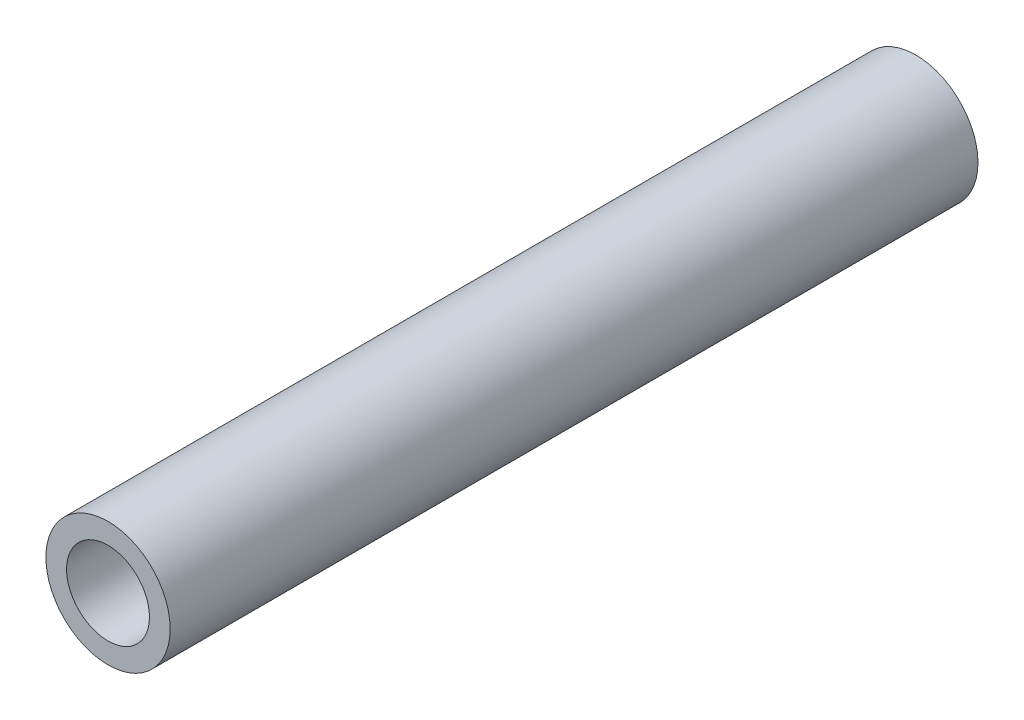
ISO-10303-21;
HEADER;
FILE_DESCRIPTION(('STEP AP214'),'2;1');
FILE_NAME('part.step','',(''),(''),'','','');
FILE_SCHEMA(('AUTOMOTIVE_DESIGN { 1 0 10303 214 1 1 1 1 }'));
ENDSEC;
DATA;
#1=APPLICATION_CONTEXT('core data for automotive mechanical design processes');
#2=APPLICATION_PROTOCOL_DEFINITION('international standard','automotive_design',2000,#1);
#3=PRODUCT_CONTEXT('',#1,'mechanical');
#4=PRODUCT('Part','Part','',(#3));
#5=PRODUCT_RELATED_PRODUCT_CATEGORY('part','',(#4));
#6=PRODUCT_DEFINITION_FORMATION('','',#4);
#7=PRODUCT_DEFINITION_CONTEXT('part definition',#1,'design');
#8=PRODUCT_DEFINITION('design','',#6,#7);
#9=PRODUCT_DEFINITION_SHAPE('','',#8);
#10=(LENGTH_UNIT() NAMED_UNIT(*) SI_UNIT(.MILLI.,.METRE.));
#11=(NAMED_UNIT(*) PLANE_ANGLE_UNIT() SI_UNIT($,.RADIAN.));
#12=(NAMED_UNIT(*) SI_UNIT($,.STERADIAN.) SOLID_ANGLE_UNIT());
#13=UNCERTAINTY_MEASURE_WITH_UNIT(LENGTH_MEASURE(1.E-05),#10,'distance_accuracy_value','');
#14=(GEOMETRIC_REPRESENTATION_CONTEXT(3) GLOBAL_UNCERTAINTY_ASSIGNED_CONTEXT((#13)) GLOBAL_UNIT_ASSIGNED_CONTEXT((#10,
#11,#12)) REPRESENTATION_CONTEXT('',''));
#15=CARTESIAN_POINT('',(0.,0.,0.));
#16=DIRECTION('',(0.,0.,1.));
#17=DIRECTION('',(1.,0.,0.));
#18=AXIS2_PLACEMENT_3D('',#15,#16,#17);
#19=CARTESIAN_POINT('',(0.,0.,19.5));
#20=DIRECTION('',(0.,0.,1.));
#21=DIRECTION('',(1.,0.,0.));
#22=AXIS2_PLACEMENT_3D('',#19,#20,#21);
#23=PLANE('',#22);
#24=CARTESIAN_POINT('',(0.,0.,19.5));
#25=DIRECTION('',(0.,0.,1.));
#26=DIRECTION('',(1.,0.,0.));
#27=AXIS2_PLACEMENT_3D('',#24,#25,#26);
#28=CIRCLE('',#27,3.);
#29=CARTESIAN_POINT('',(3.,0.,19.5));
#30=VERTEX_POINT('',#29);
#31=EDGE_CURVE('E11',#30,#30,#28,.T.);
#32=ORIENTED_EDGE('',*,*,#31,.T.);
#33=EDGE_LOOP('',(#32));
#34=FACE_BOUND('',#33,.T.);
#35=CARTESIAN_POINT('',(0.,0.,19.5));
#36=DIRECTION('',(0.,0.,1.));
#37=DIRECTION('',(1.,0.,0.));
#38=AXIS2_PLACEMENT_3D('',#35,#36,#37);
#39=CIRCLE('',#38,2.);
#40=CARTESIAN_POINT('',(2.,0.,19.5));
#41=VERTEX_POINT('',#40);
#42=EDGE_CURVE('E48',#41,#41,#39,.T.);
#43=ORIENTED_EDGE('',*,*,#42,.F.);
#44=EDGE_LOOP('',(#43));
#45=FACE_BOUND('',#44,.T.);
#46=ADVANCED_FACE('F37',(#34,#45),#23,.T.);
#47=CARTESIAN_POINT('',(0.,0.,-19.5));
#48=DIRECTION('',(0.,0.,1.));
#49=DIRECTION('',(1.,0.,0.));
#50=AXIS2_PLACEMENT_3D('',#47,#48,#49);
#51=PLANE('',#50);
#52=CARTESIAN_POINT('',(0.,0.,-19.5));
#53=DIRECTION('',(0.,0.,1.));
#54=DIRECTION('',(1.,0.,0.));
#55=AXIS2_PLACEMENT_3D('',#52,#53,#54);
#56=CIRCLE('',#55,3.);
#57=CARTESIAN_POINT('',(3.,0.,-19.5));
#58=VERTEX_POINT('',#57);
#59=EDGE_CURVE('E41',#58,#58,#56,.T.);
#60=ORIENTED_EDGE('',*,*,#59,.F.);
#61=EDGE_LOOP('',(#60));
#62=FACE_BOUND('',#61,.T.);
#63=CARTESIAN_POINT('',(0.,0.,-19.5));
#64=DIRECTION('',(0.,0.,1.));
#65=DIRECTION('',(1.,0.,0.));
#66=AXIS2_PLACEMENT_3D('',#63,#64,#65);
#67=CIRCLE('',#66,2.);
#68=CARTESIAN_POINT('',(2.,0.,-19.5));
#69=VERTEX_POINT('',#68);
#70=EDGE_CURVE('E50',#69,#69,#67,.T.);
#71=ORIENTED_EDGE('',*,*,#70,.T.);
#72=EDGE_LOOP('',(#71));
#73=FACE_BOUND('',#72,.T.);
#74=ADVANCED_FACE('F60',(#62,#73),#51,.F.);
#75=CARTESIAN_POINT('',(0.,0.,19.5));
#76=DIRECTION('',(0.,0.,-1.));
#77=DIRECTION('',(-1.,0.,0.));
#78=AXIS2_PLACEMENT_3D('',#75,#76,#77);
#79=CYLINDRICAL_SURFACE('',#78,3.);
#80=ORIENTED_EDGE('',*,*,#31,.F.);
#81=EDGE_LOOP('',(#80));
#82=FACE_BOUND('',#81,.T.);
#83=ORIENTED_EDGE('',*,*,#59,.T.);
#84=EDGE_LOOP('',(#83));
#85=FACE_BOUND('',#84,.T.);
#86=ADVANCED_FACE('F39',(#82,#85),#79,.T.);
#87=CARTESIAN_POINT('',(0.,0.,19.5));
#88=DIRECTION('',(0.,0.,-1.));
#89=DIRECTION('',(-1.,0.,0.));
#90=AXIS2_PLACEMENT_3D('',#87,#88,#89);
#91=CYLINDRICAL_SURFACE('',#90,2.);
#92=ORIENTED_EDGE('',*,*,#42,.T.);
#93=EDGE_LOOP('',(#92));
#94=FACE_BOUND('',#93,.T.);
#95=ORIENTED_EDGE('',*,*,#70,.F.);
#96=EDGE_LOOP('',(#95));
#97=FACE_BOUND('',#96,.T.);
#98=ADVANCED_FACE('F56',(#94,#97),#91,.F.);
#99=CLOSED_SHELL('',(#46,#74,#86,#98));
#100=MANIFOLD_SOLID_BREP('B2',#99);
#101=ADVANCED_BREP_SHAPE_REPRESENTATION('',(#18,#100),#14);
#102=SHAPE_DEFINITION_REPRESENTATION(#9,#101);
ENDSEC;
END-ISO-10303-21;
